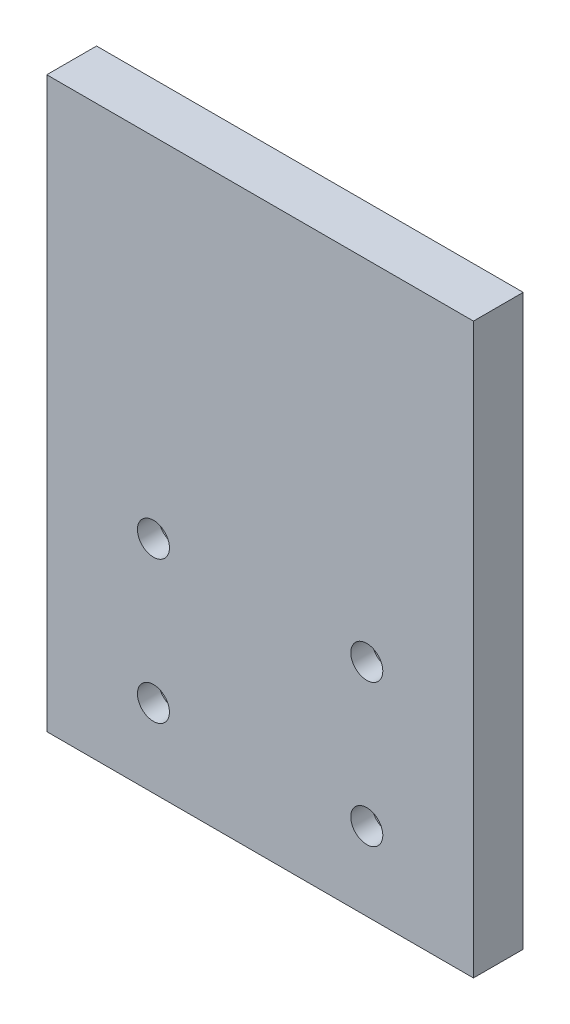
ISO-10303-21;
HEADER;
FILE_DESCRIPTION(('STEP AP214'),'2;1');
FILE_NAME('part.step','',(''),(''),'','','');
FILE_SCHEMA(('AUTOMOTIVE_DESIGN { 1 0 10303 214 1 1 1 1 }'));
ENDSEC;
DATA;
#1=APPLICATION_CONTEXT('core data for automotive mechanical design processes');
#2=APPLICATION_PROTOCOL_DEFINITION('international standard','automotive_design',2000,#1);
#3=PRODUCT_CONTEXT('',#1,'mechanical');
#4=PRODUCT('Part','Part','',(#3));
#5=PRODUCT_RELATED_PRODUCT_CATEGORY('part','',(#4));
#6=PRODUCT_DEFINITION_FORMATION('','',#4);
#7=PRODUCT_DEFINITION_CONTEXT('part definition',#1,'design');
#8=PRODUCT_DEFINITION('design','',#6,#7);
#9=PRODUCT_DEFINITION_SHAPE('','',#8);
#10=(LENGTH_UNIT() NAMED_UNIT(*) SI_UNIT(.MILLI.,.METRE.));
#11=(NAMED_UNIT(*) PLANE_ANGLE_UNIT() SI_UNIT($,.RADIAN.));
#12=(NAMED_UNIT(*) SI_UNIT($,.STERADIAN.) SOLID_ANGLE_UNIT());
#13=UNCERTAINTY_MEASURE_WITH_UNIT(LENGTH_MEASURE(1.E-05),#10,'distance_accuracy_value','');
#14=(GEOMETRIC_REPRESENTATION_CONTEXT(3) GLOBAL_UNCERTAINTY_ASSIGNED_CONTEXT((#13)) GLOBAL_UNIT_ASSIGNED_CONTEXT((#10,
#11,#12)) REPRESENTATION_CONTEXT('',''));
#15=CARTESIAN_POINT('',(0.,0.,0.));
#16=DIRECTION('',(0.,0.,1.));
#17=DIRECTION('',(1.,0.,0.));
#18=AXIS2_PLACEMENT_3D('',#15,#16,#17);
#19=CARTESIAN_POINT('',(30.,40.,7.));
#20=DIRECTION('',(-1.,0.,0.));
#21=DIRECTION('',(0.,-1.,0.));
#22=AXIS2_PLACEMENT_3D('',#19,#20,#21);
#23=PLANE('',#22);
#24=DIRECTION('',(0.,1.,0.));
#25=VECTOR('',#24,1.);
#26=CARTESIAN_POINT('',(30.,40.,0.));
#27=LINE('',#26,#25);
#28=CARTESIAN_POINT('',(30.,-40.,0.));
#29=VERTEX_POINT('',#28);
#30=CARTESIAN_POINT('',(30.,40.,0.));
#31=VERTEX_POINT('',#30);
#32=EDGE_CURVE('E111',#29,#31,#27,.T.);
#33=ORIENTED_EDGE('',*,*,#32,.T.);
#34=DIRECTION('',(0.,0.,-1.));
#35=VECTOR('',#34,1.);
#36=CARTESIAN_POINT('',(30.,40.,7.));
#37=LINE('',#36,#35);
#38=CARTESIAN_POINT('',(30.,40.,7.));
#39=VERTEX_POINT('',#38);
#40=EDGE_CURVE('E11',#39,#31,#37,.T.);
#41=ORIENTED_EDGE('',*,*,#40,.F.);
#42=DIRECTION('',(0.,1.,0.));
#43=VECTOR('',#42,1.);
#44=CARTESIAN_POINT('',(30.,40.,7.));
#45=LINE('',#44,#43);
#46=CARTESIAN_POINT('',(30.,-40.,7.));
#47=VERTEX_POINT('',#46);
#48=EDGE_CURVE('E95',#47,#39,#45,.T.);
#49=ORIENTED_EDGE('',*,*,#48,.F.);
#50=DIRECTION('',(0.,0.,-1.));
#51=VECTOR('',#50,1.);
#52=CARTESIAN_POINT('',(30.,-40.,7.));
#53=LINE('',#52,#51);
#54=EDGE_CURVE('E107',#47,#29,#53,.T.);
#55=ORIENTED_EDGE('',*,*,#54,.T.);
#56=EDGE_LOOP('',(#33,#41,#49,#55));
#57=FACE_BOUND('',#56,.T.);
#58=ADVANCED_FACE('F43',(#57),#23,.F.);
#59=CARTESIAN_POINT('',(-30.,40.,7.));
#60=DIRECTION('',(0.,-1.,0.));
#61=DIRECTION('',(0.,0.,-1.));
#62=AXIS2_PLACEMENT_3D('',#59,#60,#61);
#63=PLANE('',#62);
#64=DIRECTION('',(-1.,0.,0.));
#65=VECTOR('',#64,1.);
#66=CARTESIAN_POINT('',(-30.,40.,0.));
#67=LINE('',#66,#65);
#68=CARTESIAN_POINT('',(-30.,40.,0.));
#69=VERTEX_POINT('',#68);
#70=EDGE_CURVE('E100',#31,#69,#67,.T.);
#71=ORIENTED_EDGE('',*,*,#70,.T.);
#72=DIRECTION('',(0.,0.,-1.));
#73=VECTOR('',#72,1.);
#74=CARTESIAN_POINT('',(-30.,40.,7.));
#75=LINE('',#74,#73);
#76=CARTESIAN_POINT('',(-30.,40.,7.));
#77=VERTEX_POINT('',#76);
#78=EDGE_CURVE('E52',#77,#69,#75,.T.);
#79=ORIENTED_EDGE('',*,*,#78,.F.);
#80=DIRECTION('',(-1.,0.,0.));
#81=VECTOR('',#80,1.);
#82=CARTESIAN_POINT('',(-30.,40.,7.));
#83=LINE('',#82,#81);
#84=EDGE_CURVE('E90',#39,#77,#83,.T.);
#85=ORIENTED_EDGE('',*,*,#84,.F.);
#86=ORIENTED_EDGE('',*,*,#40,.T.);
#87=EDGE_LOOP('',(#71,#79,#85,#86));
#88=FACE_BOUND('',#87,.T.);
#89=ADVANCED_FACE('F99',(#88),#63,.F.);
#90=CARTESIAN_POINT('',(-30.,40.,7.));
#91=DIRECTION('',(1.,0.,0.));
#92=DIRECTION('',(0.,1.,0.));
#93=AXIS2_PLACEMENT_3D('',#90,#91,#92);
#94=PLANE('',#93);
#95=DIRECTION('',(0.,-1.,0.));
#96=VECTOR('',#95,1.);
#97=CARTESIAN_POINT('',(-30.,40.,0.));
#98=LINE('',#97,#96);
#99=CARTESIAN_POINT('',(-30.,-40.,0.));
#100=VERTEX_POINT('',#99);
#101=EDGE_CURVE('E77',#69,#100,#98,.T.);
#102=ORIENTED_EDGE('',*,*,#101,.T.);
#103=DIRECTION('',(0.,0.,-1.));
#104=VECTOR('',#103,1.);
#105=CARTESIAN_POINT('',(-30.,-40.,7.));
#106=LINE('',#105,#104);
#107=CARTESIAN_POINT('',(-30.,-40.,7.));
#108=VERTEX_POINT('',#107);
#109=EDGE_CURVE('E102',#108,#100,#106,.T.);
#110=ORIENTED_EDGE('',*,*,#109,.F.);
#111=DIRECTION('',(0.,-1.,0.));
#112=VECTOR('',#111,1.);
#113=CARTESIAN_POINT('',(-30.,40.,7.));
#114=LINE('',#113,#112);
#115=EDGE_CURVE('E93',#77,#108,#114,.T.);
#116=ORIENTED_EDGE('',*,*,#115,.F.);
#117=ORIENTED_EDGE('',*,*,#78,.T.);
#118=EDGE_LOOP('',(#102,#110,#116,#117));
#119=FACE_BOUND('',#118,.T.);
#120=ADVANCED_FACE('F103',(#119),#94,.F.);
#121=CARTESIAN_POINT('',(-30.,-40.,7.));
#122=DIRECTION('',(0.,1.,0.));
#123=DIRECTION('',(0.,0.,1.));
#124=AXIS2_PLACEMENT_3D('',#121,#122,#123);
#125=PLANE('',#124);
#126=DIRECTION('',(1.,0.,0.));
#127=VECTOR('',#126,1.);
#128=CARTESIAN_POINT('',(-30.,-40.,0.));
#129=LINE('',#128,#127);
#130=EDGE_CURVE('E83',#100,#29,#129,.T.);
#131=ORIENTED_EDGE('',*,*,#130,.T.);
#132=ORIENTED_EDGE('',*,*,#54,.F.);
#133=DIRECTION('',(1.,0.,0.));
#134=VECTOR('',#133,1.);
#135=CARTESIAN_POINT('',(-30.,-40.,7.));
#136=LINE('',#135,#134);
#137=EDGE_CURVE('E60',#108,#47,#136,.T.);
#138=ORIENTED_EDGE('',*,*,#137,.F.);
#139=ORIENTED_EDGE('',*,*,#109,.T.);
#140=EDGE_LOOP('',(#131,#132,#138,#139));
#141=FACE_BOUND('',#140,.T.);
#142=ADVANCED_FACE('F125',(#141),#125,.F.);
#143=CARTESIAN_POINT('',(0.,0.,7.));
#144=DIRECTION('',(0.,0.,1.));
#145=DIRECTION('',(1.,0.,0.));
#146=AXIS2_PLACEMENT_3D('',#143,#144,#145);
#147=PLANE('',#146);
#148=CARTESIAN_POINT('',(15.,-29.,7.));
#149=DIRECTION('',(0.,0.,-1.));
#150=DIRECTION('',(-1.,0.,0.));
#151=AXIS2_PLACEMENT_3D('',#148,#149,#150);
#152=CIRCLE('',#151,2.25);
#153=CARTESIAN_POINT('',(12.75,-29.,7.));
#154=VERTEX_POINT('',#153);
#155=EDGE_CURVE('E179',#154,#154,#152,.T.);
#156=ORIENTED_EDGE('',*,*,#155,.T.);
#157=EDGE_LOOP('',(#156));
#158=FACE_BOUND('',#157,.T.);
#159=CARTESIAN_POINT('',(-15.,-29.,7.));
#160=DIRECTION('',(0.,0.,-1.));
#161=DIRECTION('',(-1.,0.,0.));
#162=AXIS2_PLACEMENT_3D('',#159,#160,#161);
#163=CIRCLE('',#162,2.25);
#164=CARTESIAN_POINT('',(-17.25,-29.,7.));
#165=VERTEX_POINT('',#164);
#166=EDGE_CURVE('E163',#165,#165,#163,.T.);
#167=ORIENTED_EDGE('',*,*,#166,.T.);
#168=EDGE_LOOP('',(#167));
#169=FACE_BOUND('',#168,.T.);
#170=CARTESIAN_POINT('',(15.,-9.00000000000002,7.));
#171=DIRECTION('',(0.,0.,-1.));
#172=DIRECTION('',(-1.,0.,0.));
#173=AXIS2_PLACEMENT_3D('',#170,#171,#172);
#174=CIRCLE('',#173,2.25);
#175=CARTESIAN_POINT('',(12.75,-9.00000000000002,7.));
#176=VERTEX_POINT('',#175);
#177=EDGE_CURVE('E147',#176,#176,#174,.T.);
#178=ORIENTED_EDGE('',*,*,#177,.T.);
#179=EDGE_LOOP('',(#178));
#180=FACE_BOUND('',#179,.T.);
#181=CARTESIAN_POINT('',(-15.,-9.00000000000001,7.));
#182=DIRECTION('',(0.,0.,-1.));
#183=DIRECTION('',(-1.,0.,0.));
#184=AXIS2_PLACEMENT_3D('',#181,#182,#183);
#185=CIRCLE('',#184,2.25);
#186=CARTESIAN_POINT('',(-17.25,-9.00000000000001,7.));
#187=VERTEX_POINT('',#186);
#188=EDGE_CURVE('E115',#187,#187,#185,.T.);
#189=ORIENTED_EDGE('',*,*,#188,.T.);
#190=EDGE_LOOP('',(#189));
#191=FACE_BOUND('',#190,.T.);
#192=ORIENTED_EDGE('',*,*,#48,.T.);
#193=ORIENTED_EDGE('',*,*,#84,.T.);
#194=ORIENTED_EDGE('',*,*,#115,.T.);
#195=ORIENTED_EDGE('',*,*,#137,.T.);
#196=EDGE_LOOP('',(#192,#193,#194,#195));
#197=FACE_BOUND('',#196,.T.);
#198=ADVANCED_FACE('F91',(#158,#169,#180,#191,#197),#147,.T.);
#199=CARTESIAN_POINT('',(0.,0.,0.));
#200=DIRECTION('',(0.,0.,1.));
#201=DIRECTION('',(1.,0.,0.));
#202=AXIS2_PLACEMENT_3D('',#199,#200,#201);
#203=PLANE('',#202);
#204=CARTESIAN_POINT('',(15.,-29.,0.));
#205=DIRECTION('',(0.,0.,-1.));
#206=DIRECTION('',(-1.,0.,0.));
#207=AXIS2_PLACEMENT_3D('',#204,#205,#206);
#208=CIRCLE('',#207,3.99999999999999);
#209=CARTESIAN_POINT('',(11.,-29.,0.));
#210=VERTEX_POINT('',#209);
#211=EDGE_CURVE('E191',#210,#210,#208,.T.);
#212=ORIENTED_EDGE('',*,*,#211,.F.);
#213=EDGE_LOOP('',(#212));
#214=FACE_BOUND('',#213,.T.);
#215=CARTESIAN_POINT('',(-15.,-29.,0.));
#216=DIRECTION('',(0.,0.,-1.));
#217=DIRECTION('',(-1.,0.,0.));
#218=AXIS2_PLACEMENT_3D('',#215,#216,#217);
#219=CIRCLE('',#218,3.99999999999999);
#220=CARTESIAN_POINT('',(-19.,-29.,0.));
#221=VERTEX_POINT('',#220);
#222=EDGE_CURVE('E175',#221,#221,#219,.T.);
#223=ORIENTED_EDGE('',*,*,#222,.F.);
#224=EDGE_LOOP('',(#223));
#225=FACE_BOUND('',#224,.T.);
#226=CARTESIAN_POINT('',(15.,-9.00000000000002,0.));
#227=DIRECTION('',(0.,0.,-1.));
#228=DIRECTION('',(-1.,0.,0.));
#229=AXIS2_PLACEMENT_3D('',#226,#227,#228);
#230=CIRCLE('',#229,3.99999999999999);
#231=CARTESIAN_POINT('',(11.,-9.00000000000002,0.));
#232=VERTEX_POINT('',#231);
#233=EDGE_CURVE('E159',#232,#232,#230,.T.);
#234=ORIENTED_EDGE('',*,*,#233,.F.);
#235=EDGE_LOOP('',(#234));
#236=FACE_BOUND('',#235,.T.);
#237=CARTESIAN_POINT('',(-15.,-9.00000000000001,0.));
#238=DIRECTION('',(0.,0.,-1.));
#239=DIRECTION('',(-1.,0.,0.));
#240=AXIS2_PLACEMENT_3D('',#237,#238,#239);
#241=CIRCLE('',#240,3.99999999999999);
#242=CARTESIAN_POINT('',(-19.,-9.00000000000001,0.));
#243=VERTEX_POINT('',#242);
#244=EDGE_CURVE('E143',#243,#243,#241,.T.);
#245=ORIENTED_EDGE('',*,*,#244,.F.);
#246=EDGE_LOOP('',(#245));
#247=FACE_BOUND('',#246,.T.);
#248=ORIENTED_EDGE('',*,*,#32,.F.);
#249=ORIENTED_EDGE('',*,*,#130,.F.);
#250=ORIENTED_EDGE('',*,*,#101,.F.);
#251=ORIENTED_EDGE('',*,*,#70,.F.);
#252=EDGE_LOOP('',(#248,#249,#250,#251));
#253=FACE_BOUND('',#252,.T.);
#254=ADVANCED_FACE('F128',(#214,#225,#236,#247,#253),#203,.F.);
#255=CARTESIAN_POINT('',(-15.,-9.00000000000001,0.));
#256=DIRECTION('',(0.,0.,-1.));
#257=DIRECTION('',(-1.,0.,0.));
#258=AXIS2_PLACEMENT_3D('',#255,#256,#257);
#259=CYLINDRICAL_SURFACE('',#258,2.25000000000001);
#260=ORIENTED_EDGE('',*,*,#188,.F.);
#261=EDGE_LOOP('',(#260));
#262=FACE_BOUND('',#261,.T.);
#263=CARTESIAN_POINT('',(-15.,-9.00000000000001,4.));
#264=DIRECTION('',(0.,0.,-1.));
#265=DIRECTION('',(-1.,0.,0.));
#266=AXIS2_PLACEMENT_3D('',#263,#264,#265);
#267=CIRCLE('',#266,2.25000000000001);
#268=CARTESIAN_POINT('',(-17.25,-9.00000000000001,4.));
#269=VERTEX_POINT('',#268);
#270=EDGE_CURVE('E135',#269,#269,#267,.T.);
#271=ORIENTED_EDGE('',*,*,#270,.T.);
#272=EDGE_LOOP('',(#271));
#273=FACE_BOUND('',#272,.T.);
#274=ADVANCED_FACE('F200',(#262,#273),#259,.F.);
#275=CARTESIAN_POINT('',(-12.75,-9.00000000000001,4.));
#276=DIRECTION('',(0.,0.,1.));
#277=DIRECTION('',(1.,0.,0.));
#278=AXIS2_PLACEMENT_3D('',#275,#276,#277);
#279=PLANE('',#278);
#280=ORIENTED_EDGE('',*,*,#270,.F.);
#281=EDGE_LOOP('',(#280));
#282=FACE_BOUND('',#281,.T.);
#283=CARTESIAN_POINT('',(-15.,-9.00000000000001,4.));
#284=DIRECTION('',(0.,0.,-1.));
#285=DIRECTION('',(-1.,0.,0.));
#286=AXIS2_PLACEMENT_3D('',#283,#284,#285);
#287=CIRCLE('',#286,3.99999999999999);
#288=CARTESIAN_POINT('',(-19.,-9.00000000000001,4.));
#289=VERTEX_POINT('',#288);
#290=EDGE_CURVE('E139',#289,#289,#287,.T.);
#291=ORIENTED_EDGE('',*,*,#290,.T.);
#292=EDGE_LOOP('',(#291));
#293=FACE_BOUND('',#292,.T.);
#294=ADVANCED_FACE('F211',(#282,#293),#279,.F.);
#295=CARTESIAN_POINT('',(-15.,-9.00000000000001,0.));
#296=DIRECTION('',(0.,0.,-1.));
#297=DIRECTION('',(-1.,0.,0.));
#298=AXIS2_PLACEMENT_3D('',#295,#296,#297);
#299=CYLINDRICAL_SURFACE('',#298,3.99999999999999);
#300=ORIENTED_EDGE('',*,*,#290,.F.);
#301=EDGE_LOOP('',(#300));
#302=FACE_BOUND('',#301,.T.);
#303=ORIENTED_EDGE('',*,*,#244,.T.);
#304=EDGE_LOOP('',(#303));
#305=FACE_BOUND('',#304,.T.);
#306=ADVANCED_FACE('F208',(#302,#305),#299,.F.);
#307=CARTESIAN_POINT('',(15.,-9.00000000000002,0.));
#308=DIRECTION('',(0.,0.,-1.));
#309=DIRECTION('',(-1.,0.,0.));
#310=AXIS2_PLACEMENT_3D('',#307,#308,#309);
#311=CYLINDRICAL_SURFACE('',#310,2.25);
#312=ORIENTED_EDGE('',*,*,#177,.F.);
#313=EDGE_LOOP('',(#312));
#314=FACE_BOUND('',#313,.T.);
#315=CARTESIAN_POINT('',(15.,-9.00000000000002,4.));
#316=DIRECTION('',(0.,0.,-1.));
#317=DIRECTION('',(-1.,0.,0.));
#318=AXIS2_PLACEMENT_3D('',#315,#316,#317);
#319=CIRCLE('',#318,2.25000000000001);
#320=CARTESIAN_POINT('',(12.75,-9.00000000000002,4.));
#321=VERTEX_POINT('',#320);
#322=EDGE_CURVE('E151',#321,#321,#319,.T.);
#323=ORIENTED_EDGE('',*,*,#322,.T.);
#324=EDGE_LOOP('',(#323));
#325=FACE_BOUND('',#324,.T.);
#326=ADVANCED_FACE('F210',(#314,#325),#311,.F.);
#327=CARTESIAN_POINT('',(17.25,-9.00000000000002,4.));
#328=DIRECTION('',(0.,0.,1.));
#329=DIRECTION('',(1.,0.,0.));
#330=AXIS2_PLACEMENT_3D('',#327,#328,#329);
#331=PLANE('',#330);
#332=ORIENTED_EDGE('',*,*,#322,.F.);
#333=EDGE_LOOP('',(#332));
#334=FACE_BOUND('',#333,.T.);
#335=CARTESIAN_POINT('',(15.,-9.00000000000002,4.));
#336=DIRECTION('',(0.,0.,-1.));
#337=DIRECTION('',(-1.,0.,0.));
#338=AXIS2_PLACEMENT_3D('',#335,#336,#337);
#339=CIRCLE('',#338,3.99999999999999);
#340=CARTESIAN_POINT('',(11.,-9.00000000000002,4.));
#341=VERTEX_POINT('',#340);
#342=EDGE_CURVE('E155',#341,#341,#339,.T.);
#343=ORIENTED_EDGE('',*,*,#342,.T.);
#344=EDGE_LOOP('',(#343));
#345=FACE_BOUND('',#344,.T.);
#346=ADVANCED_FACE('F218',(#334,#345),#331,.F.);
#347=CARTESIAN_POINT('',(15.,-9.00000000000002,0.));
#348=DIRECTION('',(0.,0.,-1.));
#349=DIRECTION('',(-1.,0.,0.));
#350=AXIS2_PLACEMENT_3D('',#347,#348,#349);
#351=CYLINDRICAL_SURFACE('',#350,3.99999999999999);
#352=ORIENTED_EDGE('',*,*,#342,.F.);
#353=EDGE_LOOP('',(#352));
#354=FACE_BOUND('',#353,.T.);
#355=ORIENTED_EDGE('',*,*,#233,.T.);
#356=EDGE_LOOP('',(#355));
#357=FACE_BOUND('',#356,.T.);
#358=ADVANCED_FACE('F275',(#354,#357),#351,.F.);
#359=CARTESIAN_POINT('',(-15.,-29.,0.));
#360=DIRECTION('',(0.,0.,-1.));
#361=DIRECTION('',(-1.,0.,0.));
#362=AXIS2_PLACEMENT_3D('',#359,#360,#361);
#363=CYLINDRICAL_SURFACE('',#362,2.25000000000001);
#364=ORIENTED_EDGE('',*,*,#166,.F.);
#365=EDGE_LOOP('',(#364));
#366=FACE_BOUND('',#365,.T.);
#367=CARTESIAN_POINT('',(-15.,-29.,4.));
#368=DIRECTION('',(0.,0.,-1.));
#369=DIRECTION('',(-1.,0.,0.));
#370=AXIS2_PLACEMENT_3D('',#367,#368,#369);
#371=CIRCLE('',#370,2.25000000000001);
#372=CARTESIAN_POINT('',(-17.25,-29.,4.));
#373=VERTEX_POINT('',#372);
#374=EDGE_CURVE('E167',#373,#373,#371,.T.);
#375=ORIENTED_EDGE('',*,*,#374,.T.);
#376=EDGE_LOOP('',(#375));
#377=FACE_BOUND('',#376,.T.);
#378=ADVANCED_FACE('F286',(#366,#377),#363,.F.);
#379=CARTESIAN_POINT('',(-12.75,-29.,4.));
#380=DIRECTION('',(0.,0.,1.));
#381=DIRECTION('',(1.,0.,0.));
#382=AXIS2_PLACEMENT_3D('',#379,#380,#381);
#383=PLANE('',#382);
#384=ORIENTED_EDGE('',*,*,#374,.F.);
#385=EDGE_LOOP('',(#384));
#386=FACE_BOUND('',#385,.T.);
#387=CARTESIAN_POINT('',(-15.,-29.,4.));
#388=DIRECTION('',(0.,0.,-1.));
#389=DIRECTION('',(-1.,0.,0.));
#390=AXIS2_PLACEMENT_3D('',#387,#388,#389);
#391=CIRCLE('',#390,3.99999999999999);
#392=CARTESIAN_POINT('',(-19.,-29.,4.));
#393=VERTEX_POINT('',#392);
#394=EDGE_CURVE('E171',#393,#393,#391,.T.);
#395=ORIENTED_EDGE('',*,*,#394,.T.);
#396=EDGE_LOOP('',(#395));
#397=FACE_BOUND('',#396,.T.);
#398=ADVANCED_FACE('F297',(#386,#397),#383,.F.);
#399=CARTESIAN_POINT('',(-15.,-29.,0.));
#400=DIRECTION('',(0.,0.,-1.));
#401=DIRECTION('',(-1.,0.,0.));
#402=AXIS2_PLACEMENT_3D('',#399,#400,#401);
#403=CYLINDRICAL_SURFACE('',#402,3.99999999999999);
#404=ORIENTED_EDGE('',*,*,#394,.F.);
#405=EDGE_LOOP('',(#404));
#406=FACE_BOUND('',#405,.T.);
#407=ORIENTED_EDGE('',*,*,#222,.T.);
#408=EDGE_LOOP('',(#407));
#409=FACE_BOUND('',#408,.T.);
#410=ADVANCED_FACE('F308',(#406,#409),#403,.F.);
#411=CARTESIAN_POINT('',(15.,-29.,0.));
#412=DIRECTION('',(0.,0.,-1.));
#413=DIRECTION('',(-1.,0.,0.));
#414=AXIS2_PLACEMENT_3D('',#411,#412,#413);
#415=CYLINDRICAL_SURFACE('',#414,2.25000000000001);
#416=ORIENTED_EDGE('',*,*,#155,.F.);
#417=EDGE_LOOP('',(#416));
#418=FACE_BOUND('',#417,.T.);
#419=CARTESIAN_POINT('',(15.,-29.,4.));
#420=DIRECTION('',(0.,0.,-1.));
#421=DIRECTION('',(-1.,0.,0.));
#422=AXIS2_PLACEMENT_3D('',#419,#420,#421);
#423=CIRCLE('',#422,2.25000000000001);
#424=CARTESIAN_POINT('',(12.75,-29.,4.));
#425=VERTEX_POINT('',#424);
#426=EDGE_CURVE('E183',#425,#425,#423,.T.);
#427=ORIENTED_EDGE('',*,*,#426,.T.);
#428=EDGE_LOOP('',(#427));
#429=FACE_BOUND('',#428,.T.);
#430=ADVANCED_FACE('F319',(#418,#429),#415,.F.);
#431=CARTESIAN_POINT('',(17.25,-29.,4.));
#432=DIRECTION('',(0.,0.,1.));
#433=DIRECTION('',(1.,0.,0.));
#434=AXIS2_PLACEMENT_3D('',#431,#432,#433);
#435=PLANE('',#434);
#436=ORIENTED_EDGE('',*,*,#426,.F.);
#437=EDGE_LOOP('',(#436));
#438=FACE_BOUND('',#437,.T.);
#439=CARTESIAN_POINT('',(15.,-29.,4.));
#440=DIRECTION('',(0.,0.,-1.));
#441=DIRECTION('',(-1.,0.,0.));
#442=AXIS2_PLACEMENT_3D('',#439,#440,#441);
#443=CIRCLE('',#442,3.99999999999999);
#444=CARTESIAN_POINT('',(11.,-29.,4.));
#445=VERTEX_POINT('',#444);
#446=EDGE_CURVE('E187',#445,#445,#443,.T.);
#447=ORIENTED_EDGE('',*,*,#446,.T.);
#448=EDGE_LOOP('',(#447));
#449=FACE_BOUND('',#448,.T.);
#450=ADVANCED_FACE('F330',(#438,#449),#435,.F.);
#451=CARTESIAN_POINT('',(15.,-29.,0.));
#452=DIRECTION('',(0.,0.,-1.));
#453=DIRECTION('',(-1.,0.,0.));
#454=AXIS2_PLACEMENT_3D('',#451,#452,#453);
#455=CYLINDRICAL_SURFACE('',#454,3.99999999999999);
#456=ORIENTED_EDGE('',*,*,#446,.F.);
#457=EDGE_LOOP('',(#456));
#458=FACE_BOUND('',#457,.T.);
#459=ORIENTED_EDGE('',*,*,#211,.T.);
#460=EDGE_LOOP('',(#459));
#461=FACE_BOUND('',#460,.T.);
#462=ADVANCED_FACE('F196',(#458,#461),#455,.F.);
#463=CLOSED_SHELL('',(#58,#89,#120,#142,#198,#254,#274,#294,#306,#326,#346,#358,#378,#398,#410,
#430,#450,#462));
#464=MANIFOLD_SOLID_BREP('B2',#463);
#465=ADVANCED_BREP_SHAPE_REPRESENTATION('',(#18,#464),#14);
#466=SHAPE_DEFINITION_REPRESENTATION(#9,#465);
ENDSEC;
END-ISO-10303-21;
